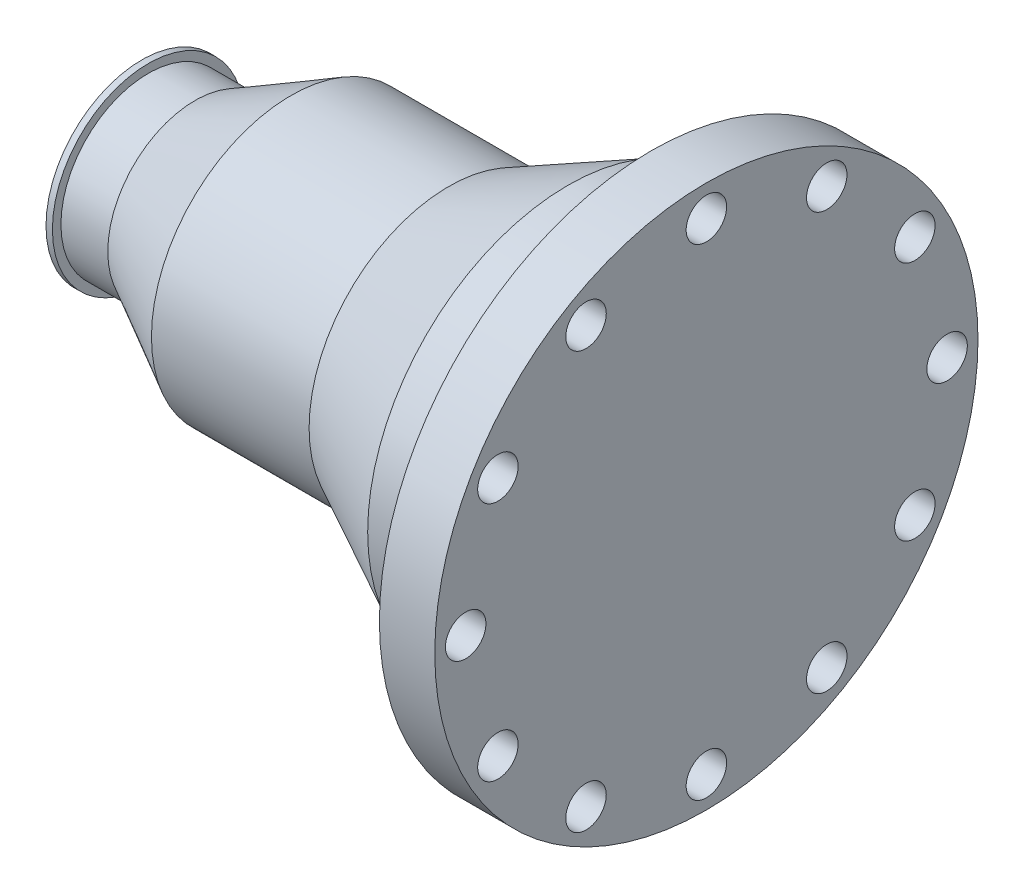
ISO-10303-21;
HEADER;
FILE_DESCRIPTION(('STEP AP214'),'2;1');
FILE_NAME('part.step','',(''),(''),'','','');
FILE_SCHEMA(('AUTOMOTIVE_DESIGN { 1 0 10303 214 1 1 1 1 }'));
ENDSEC;
DATA;
#1=APPLICATION_CONTEXT('core data for automotive mechanical design processes');
#2=APPLICATION_PROTOCOL_DEFINITION('international standard','automotive_design',2000,#1);
#3=PRODUCT_CONTEXT('',#1,'mechanical');
#4=PRODUCT('Part','Part','',(#3));
#5=PRODUCT_RELATED_PRODUCT_CATEGORY('part','',(#4));
#6=PRODUCT_DEFINITION_FORMATION('','',#4);
#7=PRODUCT_DEFINITION_CONTEXT('part definition',#1,'design');
#8=PRODUCT_DEFINITION('design','',#6,#7);
#9=PRODUCT_DEFINITION_SHAPE('','',#8);
#10=(LENGTH_UNIT() NAMED_UNIT(*) SI_UNIT(.MILLI.,.METRE.));
#11=(NAMED_UNIT(*) PLANE_ANGLE_UNIT() SI_UNIT($,.RADIAN.));
#12=(NAMED_UNIT(*) SI_UNIT($,.STERADIAN.) SOLID_ANGLE_UNIT());
#13=UNCERTAINTY_MEASURE_WITH_UNIT(LENGTH_MEASURE(1.E-05),#10,'distance_accuracy_value','');
#14=(GEOMETRIC_REPRESENTATION_CONTEXT(3) GLOBAL_UNCERTAINTY_ASSIGNED_CONTEXT((#13)) GLOBAL_UNIT_ASSIGNED_CONTEXT((#10,
#11,#12)) REPRESENTATION_CONTEXT('',''));
#15=CARTESIAN_POINT('',(0.,0.,0.));
#16=DIRECTION('',(0.,0.,1.));
#17=DIRECTION('',(1.,0.,0.));
#18=AXIS2_PLACEMENT_3D('',#15,#16,#17);
#19=CARTESIAN_POINT('',(0.,0.,0.));
#20=DIRECTION('',(1.,0.,0.));
#21=DIRECTION('',(0.,0.,-1.));
#22=AXIS2_PLACEMENT_3D('',#19,#20,#21);
#23=PLANE('',#22);
#24=CARTESIAN_POINT('',(0.,0.,0.));
#25=DIRECTION('',(-1.,0.,0.));
#26=DIRECTION('',(0.,0.,1.));
#27=AXIS2_PLACEMENT_3D('',#24,#25,#26);
#28=CIRCLE('',#27,31.);
#29=CARTESIAN_POINT('',(0.,0.,31.));
#30=VERTEX_POINT('',#29);
#31=EDGE_CURVE('E80',#30,#30,#28,.T.);
#32=ORIENTED_EDGE('',*,*,#31,.F.);
#33=EDGE_LOOP('',(#32));
#34=FACE_BOUND('',#33,.T.);
#35=CARTESIAN_POINT('',(0.,0.,0.));
#36=DIRECTION('',(-1.,0.,0.));
#37=DIRECTION('',(0.,0.,1.));
#38=AXIS2_PLACEMENT_3D('',#35,#36,#37);
#39=CIRCLE('',#38,45.);
#40=CARTESIAN_POINT('',(0.,0.,45.));
#41=VERTEX_POINT('',#40);
#42=EDGE_CURVE('E10',#41,#41,#39,.T.);
#43=ORIENTED_EDGE('',*,*,#42,.T.);
#44=EDGE_LOOP('',(#43));
#45=FACE_BOUND('',#44,.T.);
#46=ADVANCED_FACE('F37',(#34,#45),#23,.F.);
#47=CARTESIAN_POINT('',(0.,0.,0.));
#48=DIRECTION('',(-1.,0.,0.));
#49=DIRECTION('',(0.,0.,1.));
#50=AXIS2_PLACEMENT_3D('',#47,#48,#49);
#51=CYLINDRICAL_SURFACE('',#50,45.);
#52=ORIENTED_EDGE('',*,*,#42,.F.);
#53=EDGE_LOOP('',(#52));
#54=FACE_BOUND('',#53,.T.);
#55=CARTESIAN_POINT('',(3.,0.,0.));
#56=DIRECTION('',(-1.,0.,0.));
#57=DIRECTION('',(0.,0.,1.));
#58=AXIS2_PLACEMENT_3D('',#55,#56,#57);
#59=CIRCLE('',#58,45.);
#60=CARTESIAN_POINT('',(3.,0.,45.));
#61=VERTEX_POINT('',#60);
#62=EDGE_CURVE('E43',#61,#61,#59,.T.);
#63=ORIENTED_EDGE('',*,*,#62,.T.);
#64=EDGE_LOOP('',(#63));
#65=FACE_BOUND('',#64,.T.);
#66=ADVANCED_FACE('F238',(#54,#65),#51,.T.);
#67=CARTESIAN_POINT('',(3.,45.,0.));
#68=DIRECTION('',(-1.,0.,0.));
#69=DIRECTION('',(0.,0.,1.));
#70=AXIS2_PLACEMENT_3D('',#67,#68,#69);
#71=PLANE('',#70);
#72=ORIENTED_EDGE('',*,*,#62,.F.);
#73=EDGE_LOOP('',(#72));
#74=FACE_BOUND('',#73,.T.);
#75=CARTESIAN_POINT('',(3.,0.,0.));
#76=DIRECTION('',(-1.,0.,0.));
#77=DIRECTION('',(0.,0.,1.));
#78=AXIS2_PLACEMENT_3D('',#75,#76,#77);
#79=CIRCLE('',#78,41.);
#80=CARTESIAN_POINT('',(3.,0.,41.));
#81=VERTEX_POINT('',#80);
#82=EDGE_CURVE('E47',#81,#81,#79,.T.);
#83=ORIENTED_EDGE('',*,*,#82,.T.);
#84=EDGE_LOOP('',(#83));
#85=FACE_BOUND('',#84,.T.);
#86=ADVANCED_FACE('F244',(#74,#85),#71,.F.);
#87=CARTESIAN_POINT('',(0.,0.,0.));
#88=DIRECTION('',(-1.,0.,0.));
#89=DIRECTION('',(0.,0.,1.));
#90=AXIS2_PLACEMENT_3D('',#87,#88,#89);
#91=CYLINDRICAL_SURFACE('',#90,41.);
#92=ORIENTED_EDGE('',*,*,#82,.F.);
#93=EDGE_LOOP('',(#92));
#94=FACE_BOUND('',#93,.T.);
#95=CARTESIAN_POINT('',(25.,0.,0.));
#96=DIRECTION('',(-1.,0.,0.));
#97=DIRECTION('',(0.,0.,1.));
#98=AXIS2_PLACEMENT_3D('',#95,#96,#97);
#99=CIRCLE('',#98,41.);
#100=CARTESIAN_POINT('',(25.,0.,41.));
#101=VERTEX_POINT('',#100);
#102=EDGE_CURVE('E51',#101,#101,#99,.T.);
#103=ORIENTED_EDGE('',*,*,#102,.T.);
#104=EDGE_LOOP('',(#103));
#105=FACE_BOUND('',#104,.T.);
#106=ADVANCED_FACE('F574',(#94,#105),#91,.T.);
#107=CARTESIAN_POINT('',(70.,0.,0.));
#108=DIRECTION('',(1.,0.,0.));
#109=DIRECTION('',(0.,0.,-1.));
#110=AXIS2_PLACEMENT_3D('',#107,#108,#109);
#111=CONICAL_SURFACE('',#110,65.5,0.498567905638218);
#112=ORIENTED_EDGE('',*,*,#102,.F.);
#113=EDGE_LOOP('',(#112));
#114=FACE_BOUND('',#113,.T.);
#115=CARTESIAN_POINT('',(70.,0.,0.));
#116=DIRECTION('',(-1.,0.,0.));
#117=DIRECTION('',(0.,0.,1.));
#118=AXIS2_PLACEMENT_3D('',#115,#116,#117);
#119=CIRCLE('',#118,65.5);
#120=CARTESIAN_POINT('',(70.,0.,65.5));
#121=VERTEX_POINT('',#120);
#122=EDGE_CURVE('E56',#121,#121,#119,.T.);
#123=ORIENTED_EDGE('',*,*,#122,.T.);
#124=EDGE_LOOP('',(#123));
#125=FACE_BOUND('',#124,.T.);
#126=ADVANCED_FACE('F565',(#114,#125),#111,.T.);
#127=CARTESIAN_POINT('',(0.,0.,0.));
#128=DIRECTION('',(-1.,0.,0.));
#129=DIRECTION('',(0.,0.,1.));
#130=AXIS2_PLACEMENT_3D('',#127,#128,#129);
#131=CYLINDRICAL_SURFACE('',#130,65.5);
#132=ORIENTED_EDGE('',*,*,#122,.F.);
#133=EDGE_LOOP('',(#132));
#134=FACE_BOUND('',#133,.T.);
#135=CARTESIAN_POINT('',(144.,0.,0.));
#136=DIRECTION('',(-1.,0.,0.));
#137=DIRECTION('',(0.,0.,1.));
#138=AXIS2_PLACEMENT_3D('',#135,#136,#137);
#139=CIRCLE('',#138,65.5);
#140=CARTESIAN_POINT('',(144.,0.,65.5));
#141=VERTEX_POINT('',#140);
#142=EDGE_CURVE('E59',#141,#141,#139,.T.);
#143=ORIENTED_EDGE('',*,*,#142,.T.);
#144=EDGE_LOOP('',(#143));
#145=FACE_BOUND('',#144,.T.);
#146=ADVANCED_FACE('F556',(#134,#145),#131,.T.);
#147=CARTESIAN_POINT('',(200.,0.,0.));
#148=DIRECTION('',(1.,0.,0.));
#149=DIRECTION('',(0.,0.,-1.));
#150=AXIS2_PLACEMENT_3D('',#147,#148,#149);
#151=CONICAL_SURFACE('',#150,94.,0.470764926542016);
#152=ORIENTED_EDGE('',*,*,#142,.F.);
#153=EDGE_LOOP('',(#152));
#154=FACE_BOUND('',#153,.T.);
#155=CARTESIAN_POINT('',(200.,0.,0.));
#156=DIRECTION('',(-1.,0.,0.));
#157=DIRECTION('',(0.,0.,1.));
#158=AXIS2_PLACEMENT_3D('',#155,#156,#157);
#159=CIRCLE('',#158,94.);
#160=CARTESIAN_POINT('',(200.,0.,94.));
#161=VERTEX_POINT('',#160);
#162=EDGE_CURVE('E62',#161,#161,#159,.T.);
#163=ORIENTED_EDGE('',*,*,#162,.T.);
#164=EDGE_LOOP('',(#163));
#165=FACE_BOUND('',#164,.T.);
#166=ADVANCED_FACE('F547',(#154,#165),#151,.T.);
#167=CARTESIAN_POINT('',(0.,0.,0.));
#168=DIRECTION('',(-1.,0.,0.));
#169=DIRECTION('',(0.,0.,1.));
#170=AXIS2_PLACEMENT_3D('',#167,#168,#169);
#171=CYLINDRICAL_SURFACE('',#170,94.);
#172=ORIENTED_EDGE('',*,*,#162,.F.);
#173=EDGE_LOOP('',(#172));
#174=FACE_BOUND('',#173,.T.);
#175=CARTESIAN_POINT('',(220.,0.,0.));
#176=DIRECTION('',(-1.,0.,0.));
#177=DIRECTION('',(0.,0.,1.));
#178=AXIS2_PLACEMENT_3D('',#175,#176,#177);
#179=CIRCLE('',#178,94.);
#180=CARTESIAN_POINT('',(220.,0.,94.));
#181=VERTEX_POINT('',#180);
#182=EDGE_CURVE('E65',#181,#181,#179,.T.);
#183=ORIENTED_EDGE('',*,*,#182,.T.);
#184=EDGE_LOOP('',(#183));
#185=FACE_BOUND('',#184,.T.);
#186=ADVANCED_FACE('F538',(#174,#185),#171,.T.);
#187=CARTESIAN_POINT('',(220.,94.,0.));
#188=DIRECTION('',(1.,0.,0.));
#189=DIRECTION('',(0.,0.,-1.));
#190=AXIS2_PLACEMENT_3D('',#187,#188,#189);
#191=PLANE('',#190);
#192=ORIENTED_EDGE('',*,*,#182,.F.);
#193=EDGE_LOOP('',(#192));
#194=FACE_BOUND('',#193,.T.);
#195=CARTESIAN_POINT('',(220.,0.,0.));
#196=DIRECTION('',(-1.,0.,0.));
#197=DIRECTION('',(0.,0.,1.));
#198=AXIS2_PLACEMENT_3D('',#195,#196,#197);
#199=CIRCLE('',#198,95.);
#200=CARTESIAN_POINT('',(220.,0.,95.));
#201=VERTEX_POINT('',#200);
#202=EDGE_CURVE('E68',#201,#201,#199,.T.);
#203=ORIENTED_EDGE('',*,*,#202,.T.);
#204=EDGE_LOOP('',(#203));
#205=FACE_BOUND('',#204,.T.);
#206=ADVANCED_FACE('F529',(#194,#205),#191,.F.);
#207=CARTESIAN_POINT('',(0.,0.,0.));
#208=DIRECTION('',(-1.,0.,0.));
#209=DIRECTION('',(0.,0.,1.));
#210=AXIS2_PLACEMENT_3D('',#207,#208,#209);
#211=CYLINDRICAL_SURFACE('',#210,95.);
#212=ORIENTED_EDGE('',*,*,#202,.F.);
#213=EDGE_LOOP('',(#212));
#214=FACE_BOUND('',#213,.T.);
#215=CARTESIAN_POINT('',(239.,0.,0.));
#216=DIRECTION('',(-1.,0.,0.));
#217=DIRECTION('',(0.,0.,1.));
#218=AXIS2_PLACEMENT_3D('',#215,#216,#217);
#219=CIRCLE('',#218,95.);
#220=CARTESIAN_POINT('',(239.,0.,95.));
#221=VERTEX_POINT('',#220);
#222=EDGE_CURVE('E71',#221,#221,#219,.T.);
#223=ORIENTED_EDGE('',*,*,#222,.T.);
#224=EDGE_LOOP('',(#223));
#225=FACE_BOUND('',#224,.T.);
#226=ADVANCED_FACE('F234',(#214,#225),#211,.T.);
#227=CARTESIAN_POINT('',(239.,100.,0.));
#228=DIRECTION('',(1.,0.,0.));
#229=DIRECTION('',(0.,0.,-1.));
#230=AXIS2_PLACEMENT_3D('',#227,#228,#229);
#231=PLANE('',#230);
#232=CARTESIAN_POINT('',(239.,97.8608706276416,-56.5));
#233=DIRECTION('',(1.,0.,0.));
#234=DIRECTION('',(0.,0.,-1.));
#235=AXIS2_PLACEMENT_3D('',#232,#233,#234);
#236=CIRCLE('',#235,9.50000000000001);
#237=CARTESIAN_POINT('',(239.,97.8608706276416,-66.));
#238=VERTEX_POINT('',#237);
#239=EDGE_CURVE('E185',#238,#238,#236,.F.);
#240=ORIENTED_EDGE('',*,*,#239,.F.);
#241=EDGE_LOOP('',(#240));
#242=FACE_BOUND('',#241,.T.);
#243=CARTESIAN_POINT('',(239.,56.4999999999999,-97.8608706276416));
#244=DIRECTION('',(1.,0.,0.));
#245=DIRECTION('',(0.,0.,-1.));
#246=AXIS2_PLACEMENT_3D('',#243,#244,#245);
#247=CIRCLE('',#246,9.5);
#248=CARTESIAN_POINT('',(239.,56.4999999999999,-107.360870627642));
#249=VERTEX_POINT('',#248);
#250=EDGE_CURVE('E179',#249,#249,#247,.F.);
#251=ORIENTED_EDGE('',*,*,#250,.F.);
#252=EDGE_LOOP('',(#251));
#253=FACE_BOUND('',#252,.T.);
#254=CARTESIAN_POINT('',(239.,0.,-113.));
#255=DIRECTION('',(1.,0.,0.));
#256=DIRECTION('',(0.,0.,-1.));
#257=AXIS2_PLACEMENT_3D('',#254,#255,#256);
#258=CIRCLE('',#257,9.49999999999999);
#259=CARTESIAN_POINT('',(239.,0.,-122.5));
#260=VERTEX_POINT('',#259);
#261=EDGE_CURVE('E173',#260,#260,#258,.F.);
#262=ORIENTED_EDGE('',*,*,#261,.F.);
#263=EDGE_LOOP('',(#262));
#264=FACE_BOUND('',#263,.T.);
#265=CARTESIAN_POINT('',(239.,-56.5,-97.8608706276415));
#266=DIRECTION('',(1.,0.,0.));
#267=DIRECTION('',(0.,0.,-1.));
#268=AXIS2_PLACEMENT_3D('',#265,#266,#267);
#269=CIRCLE('',#268,9.5);
#270=CARTESIAN_POINT('',(239.,-56.5,-107.360870627642));
#271=VERTEX_POINT('',#270);
#272=EDGE_CURVE('E167',#271,#271,#269,.F.);
#273=ORIENTED_EDGE('',*,*,#272,.F.);
#274=EDGE_LOOP('',(#273));
#275=FACE_BOUND('',#274,.T.);
#276=CARTESIAN_POINT('',(239.,-97.8608706276416,-56.5));
#277=DIRECTION('',(1.,0.,0.));
#278=DIRECTION('',(0.,0.,-1.));
#279=AXIS2_PLACEMENT_3D('',#276,#277,#278);
#280=CIRCLE('',#279,9.50000000000001);
#281=CARTESIAN_POINT('',(239.,-97.8608706276416,-66.));
#282=VERTEX_POINT('',#281);
#283=EDGE_CURVE('E161',#282,#282,#280,.F.);
#284=ORIENTED_EDGE('',*,*,#283,.F.);
#285=EDGE_LOOP('',(#284));
#286=FACE_BOUND('',#285,.T.);
#287=CARTESIAN_POINT('',(239.,-113.,0.));
#288=DIRECTION('',(1.,0.,0.));
#289=DIRECTION('',(0.,0.,-1.));
#290=AXIS2_PLACEMENT_3D('',#287,#288,#289);
#291=CIRCLE('',#290,9.49999999999998);
#292=CARTESIAN_POINT('',(239.,-113.,-9.49999999999998));
#293=VERTEX_POINT('',#292);
#294=EDGE_CURVE('E155',#293,#293,#291,.F.);
#295=ORIENTED_EDGE('',*,*,#294,.F.);
#296=EDGE_LOOP('',(#295));
#297=FACE_BOUND('',#296,.T.);
#298=CARTESIAN_POINT('',(239.,-97.8608706276415,56.5));
#299=DIRECTION('',(1.,0.,0.));
#300=DIRECTION('',(0.,0.,-1.));
#301=AXIS2_PLACEMENT_3D('',#298,#299,#300);
#302=CIRCLE('',#301,9.5);
#303=CARTESIAN_POINT('',(239.,-97.8608706276415,47.));
#304=VERTEX_POINT('',#303);
#305=EDGE_CURVE('E149',#304,#304,#302,.F.);
#306=ORIENTED_EDGE('',*,*,#305,.F.);
#307=EDGE_LOOP('',(#306));
#308=FACE_BOUND('',#307,.T.);
#309=CARTESIAN_POINT('',(239.,-56.5,97.8608706276416));
#310=DIRECTION('',(1.,0.,0.));
#311=DIRECTION('',(0.,0.,-1.));
#312=AXIS2_PLACEMENT_3D('',#309,#310,#311);
#313=CIRCLE('',#312,9.5);
#314=CARTESIAN_POINT('',(239.,-56.5,88.3608706276416));
#315=VERTEX_POINT('',#314);
#316=EDGE_CURVE('E143',#315,#315,#313,.F.);
#317=ORIENTED_EDGE('',*,*,#316,.F.);
#318=EDGE_LOOP('',(#317));
#319=FACE_BOUND('',#318,.T.);
#320=CARTESIAN_POINT('',(239.,0.,113.));
#321=DIRECTION('',(1.,0.,0.));
#322=DIRECTION('',(0.,0.,-1.));
#323=AXIS2_PLACEMENT_3D('',#320,#321,#322);
#324=CIRCLE('',#323,9.49999999999999);
#325=CARTESIAN_POINT('',(239.,0.,103.5));
#326=VERTEX_POINT('',#325);
#327=EDGE_CURVE('E137',#326,#326,#324,.F.);
#328=ORIENTED_EDGE('',*,*,#327,.F.);
#329=EDGE_LOOP('',(#328));
#330=FACE_BOUND('',#329,.T.);
#331=CARTESIAN_POINT('',(239.,56.5,97.8608706276416));
#332=DIRECTION('',(1.,0.,0.));
#333=DIRECTION('',(0.,0.,-1.));
#334=AXIS2_PLACEMENT_3D('',#331,#332,#333);
#335=CIRCLE('',#334,9.5);
#336=CARTESIAN_POINT('',(239.,56.5,88.3608706276416));
#337=VERTEX_POINT('',#336);
#338=EDGE_CURVE('E131',#337,#337,#335,.F.);
#339=ORIENTED_EDGE('',*,*,#338,.F.);
#340=EDGE_LOOP('',(#339));
#341=FACE_BOUND('',#340,.T.);
#342=CARTESIAN_POINT('',(239.,97.8608706276416,56.5));
#343=DIRECTION('',(1.,0.,0.));
#344=DIRECTION('',(0.,0.,-1.));
#345=AXIS2_PLACEMENT_3D('',#342,#343,#344);
#346=CIRCLE('',#345,9.5);
#347=CARTESIAN_POINT('',(239.,97.8608706276416,47.));
#348=VERTEX_POINT('',#347);
#349=EDGE_CURVE('E125',#348,#348,#346,.F.);
#350=ORIENTED_EDGE('',*,*,#349,.F.);
#351=EDGE_LOOP('',(#350));
#352=FACE_BOUND('',#351,.T.);
#353=CARTESIAN_POINT('',(239.,113.,0.));
#354=DIRECTION('',(1.,0.,0.));
#355=DIRECTION('',(0.,0.,-1.));
#356=AXIS2_PLACEMENT_3D('',#353,#354,#355);
#357=CIRCLE('',#356,9.50000000000001);
#358=CARTESIAN_POINT('',(239.,113.,-9.50000000000001));
#359=VERTEX_POINT('',#358);
#360=EDGE_CURVE('E119',#359,#359,#357,.F.);
#361=ORIENTED_EDGE('',*,*,#360,.F.);
#362=EDGE_LOOP('',(#361));
#363=FACE_BOUND('',#362,.T.);
#364=ORIENTED_EDGE('',*,*,#222,.F.);
#365=EDGE_LOOP('',(#364));
#366=FACE_BOUND('',#365,.T.);
#367=CARTESIAN_POINT('',(239.,0.,0.));
#368=DIRECTION('',(-1.,0.,0.));
#369=DIRECTION('',(0.,0.,1.));
#370=AXIS2_PLACEMENT_3D('',#367,#368,#369);
#371=CIRCLE('',#370,127.5);
#372=CARTESIAN_POINT('',(239.,0.,127.5));
#373=VERTEX_POINT('',#372);
#374=EDGE_CURVE('E74',#373,#373,#371,.T.);
#375=ORIENTED_EDGE('',*,*,#374,.T.);
#376=EDGE_LOOP('',(#375));
#377=FACE_BOUND('',#376,.T.);
#378=ADVANCED_FACE('F226',(#242,#253,#264,#275,#286,#297,#308,#319,#330,#341,#352,#363,#366,
#377),#231,.F.);
#379=CARTESIAN_POINT('',(0.,0.,0.));
#380=DIRECTION('',(-1.,0.,0.));
#381=DIRECTION('',(0.,0.,1.));
#382=AXIS2_PLACEMENT_3D('',#379,#380,#381);
#383=CYLINDRICAL_SURFACE('',#382,127.5);
#384=ORIENTED_EDGE('',*,*,#374,.F.);
#385=EDGE_LOOP('',(#384));
#386=FACE_BOUND('',#385,.T.);
#387=CARTESIAN_POINT('',(265.,0.,0.));
#388=DIRECTION('',(-1.,0.,0.));
#389=DIRECTION('',(0.,0.,1.));
#390=AXIS2_PLACEMENT_3D('',#387,#388,#389);
#391=CIRCLE('',#390,127.5);
#392=CARTESIAN_POINT('',(265.,0.,127.5));
#393=VERTEX_POINT('',#392);
#394=EDGE_CURVE('E77',#393,#393,#391,.T.);
#395=ORIENTED_EDGE('',*,*,#394,.T.);
#396=EDGE_LOOP('',(#395));
#397=FACE_BOUND('',#396,.T.);
#398=ADVANCED_FACE('F199',(#386,#397),#383,.T.);
#399=CARTESIAN_POINT('',(265.,127.5,0.));
#400=DIRECTION('',(-1.,0.,0.));
#401=DIRECTION('',(0.,0.,1.));
#402=AXIS2_PLACEMENT_3D('',#399,#400,#401);
#403=PLANE('',#402);
#404=CARTESIAN_POINT('',(265.,97.8608706276416,-56.5));
#405=DIRECTION('',(1.,0.,0.));
#406=DIRECTION('',(0.,0.,-1.));
#407=AXIS2_PLACEMENT_3D('',#404,#405,#406);
#408=CIRCLE('',#407,9.50000000000001);
#409=CARTESIAN_POINT('',(265.,97.8608706276416,-66.));
#410=VERTEX_POINT('',#409);
#411=EDGE_CURVE('E188',#410,#410,#408,.T.);
#412=ORIENTED_EDGE('',*,*,#411,.F.);
#413=EDGE_LOOP('',(#412));
#414=FACE_BOUND('',#413,.T.);
#415=CARTESIAN_POINT('',(265.,56.4999999999999,-97.8608706276416));
#416=DIRECTION('',(1.,0.,0.));
#417=DIRECTION('',(0.,0.,-1.));
#418=AXIS2_PLACEMENT_3D('',#415,#416,#417);
#419=CIRCLE('',#418,9.5);
#420=CARTESIAN_POINT('',(265.,56.4999999999999,-107.360870627642));
#421=VERTEX_POINT('',#420);
#422=EDGE_CURVE('E182',#421,#421,#419,.T.);
#423=ORIENTED_EDGE('',*,*,#422,.F.);
#424=EDGE_LOOP('',(#423));
#425=FACE_BOUND('',#424,.T.);
#426=CARTESIAN_POINT('',(265.,0.,-113.));
#427=DIRECTION('',(1.,0.,0.));
#428=DIRECTION('',(0.,0.,-1.));
#429=AXIS2_PLACEMENT_3D('',#426,#427,#428);
#430=CIRCLE('',#429,9.49999999999999);
#431=CARTESIAN_POINT('',(265.,0.,-122.5));
#432=VERTEX_POINT('',#431);
#433=EDGE_CURVE('E176',#432,#432,#430,.T.);
#434=ORIENTED_EDGE('',*,*,#433,.F.);
#435=EDGE_LOOP('',(#434));
#436=FACE_BOUND('',#435,.T.);
#437=CARTESIAN_POINT('',(265.,-56.5,-97.8608706276415));
#438=DIRECTION('',(1.,0.,0.));
#439=DIRECTION('',(0.,0.,-1.));
#440=AXIS2_PLACEMENT_3D('',#437,#438,#439);
#441=CIRCLE('',#440,9.5);
#442=CARTESIAN_POINT('',(265.,-56.5,-107.360870627642));
#443=VERTEX_POINT('',#442);
#444=EDGE_CURVE('E170',#443,#443,#441,.T.);
#445=ORIENTED_EDGE('',*,*,#444,.F.);
#446=EDGE_LOOP('',(#445));
#447=FACE_BOUND('',#446,.T.);
#448=CARTESIAN_POINT('',(265.,-97.8608706276416,-56.5));
#449=DIRECTION('',(1.,0.,0.));
#450=DIRECTION('',(0.,0.,-1.));
#451=AXIS2_PLACEMENT_3D('',#448,#449,#450);
#452=CIRCLE('',#451,9.50000000000001);
#453=CARTESIAN_POINT('',(265.,-97.8608706276416,-66.));
#454=VERTEX_POINT('',#453);
#455=EDGE_CURVE('E164',#454,#454,#452,.T.);
#456=ORIENTED_EDGE('',*,*,#455,.F.);
#457=EDGE_LOOP('',(#456));
#458=FACE_BOUND('',#457,.T.);
#459=CARTESIAN_POINT('',(265.,-113.,0.));
#460=DIRECTION('',(1.,0.,0.));
#461=DIRECTION('',(0.,0.,-1.));
#462=AXIS2_PLACEMENT_3D('',#459,#460,#461);
#463=CIRCLE('',#462,9.49999999999998);
#464=CARTESIAN_POINT('',(265.,-113.,-9.49999999999998));
#465=VERTEX_POINT('',#464);
#466=EDGE_CURVE('E158',#465,#465,#463,.T.);
#467=ORIENTED_EDGE('',*,*,#466,.F.);
#468=EDGE_LOOP('',(#467));
#469=FACE_BOUND('',#468,.T.);
#470=CARTESIAN_POINT('',(265.,-97.8608706276415,56.5));
#471=DIRECTION('',(1.,0.,0.));
#472=DIRECTION('',(0.,0.,-1.));
#473=AXIS2_PLACEMENT_3D('',#470,#471,#472);
#474=CIRCLE('',#473,9.5);
#475=CARTESIAN_POINT('',(265.,-97.8608706276415,47.));
#476=VERTEX_POINT('',#475);
#477=EDGE_CURVE('E152',#476,#476,#474,.T.);
#478=ORIENTED_EDGE('',*,*,#477,.F.);
#479=EDGE_LOOP('',(#478));
#480=FACE_BOUND('',#479,.T.);
#481=CARTESIAN_POINT('',(265.,-56.5,97.8608706276416));
#482=DIRECTION('',(1.,0.,0.));
#483=DIRECTION('',(0.,0.,-1.));
#484=AXIS2_PLACEMENT_3D('',#481,#482,#483);
#485=CIRCLE('',#484,9.5);
#486=CARTESIAN_POINT('',(265.,-56.5,88.3608706276416));
#487=VERTEX_POINT('',#486);
#488=EDGE_CURVE('E146',#487,#487,#485,.T.);
#489=ORIENTED_EDGE('',*,*,#488,.F.);
#490=EDGE_LOOP('',(#489));
#491=FACE_BOUND('',#490,.T.);
#492=CARTESIAN_POINT('',(265.,0.,113.));
#493=DIRECTION('',(1.,0.,0.));
#494=DIRECTION('',(0.,0.,-1.));
#495=AXIS2_PLACEMENT_3D('',#492,#493,#494);
#496=CIRCLE('',#495,9.49999999999999);
#497=CARTESIAN_POINT('',(265.,0.,103.5));
#498=VERTEX_POINT('',#497);
#499=EDGE_CURVE('E140',#498,#498,#496,.T.);
#500=ORIENTED_EDGE('',*,*,#499,.F.);
#501=EDGE_LOOP('',(#500));
#502=FACE_BOUND('',#501,.T.);
#503=CARTESIAN_POINT('',(265.,56.5,97.8608706276416));
#504=DIRECTION('',(1.,0.,0.));
#505=DIRECTION('',(0.,0.,-1.));
#506=AXIS2_PLACEMENT_3D('',#503,#504,#505);
#507=CIRCLE('',#506,9.5);
#508=CARTESIAN_POINT('',(265.,56.5,88.3608706276416));
#509=VERTEX_POINT('',#508);
#510=EDGE_CURVE('E134',#509,#509,#507,.T.);
#511=ORIENTED_EDGE('',*,*,#510,.F.);
#512=EDGE_LOOP('',(#511));
#513=FACE_BOUND('',#512,.T.);
#514=CARTESIAN_POINT('',(265.,97.8608706276416,56.5));
#515=DIRECTION('',(1.,0.,0.));
#516=DIRECTION('',(0.,0.,-1.));
#517=AXIS2_PLACEMENT_3D('',#514,#515,#516);
#518=CIRCLE('',#517,9.5);
#519=CARTESIAN_POINT('',(265.,97.8608706276416,47.));
#520=VERTEX_POINT('',#519);
#521=EDGE_CURVE('E128',#520,#520,#518,.T.);
#522=ORIENTED_EDGE('',*,*,#521,.F.);
#523=EDGE_LOOP('',(#522));
#524=FACE_BOUND('',#523,.T.);
#525=CARTESIAN_POINT('',(265.,113.,0.));
#526=DIRECTION('',(1.,0.,0.));
#527=DIRECTION('',(0.,0.,-1.));
#528=AXIS2_PLACEMENT_3D('',#525,#526,#527);
#529=CIRCLE('',#528,9.50000000000001);
#530=CARTESIAN_POINT('',(265.,113.,-9.50000000000001));
#531=VERTEX_POINT('',#530);
#532=EDGE_CURVE('E122',#531,#531,#529,.T.);
#533=ORIENTED_EDGE('',*,*,#532,.F.);
#534=EDGE_LOOP('',(#533));
#535=FACE_BOUND('',#534,.T.);
#536=ORIENTED_EDGE('',*,*,#394,.F.);
#537=EDGE_LOOP('',(#536));
#538=FACE_BOUND('',#537,.T.);
#539=ADVANCED_FACE('F195',(#414,#425,#436,#447,#458,#469,#480,#491,#502,#513,#524,#535,#538),
#403,.F.);
#540=CARTESIAN_POINT('',(0.,0.,0.));
#541=DIRECTION('',(-1.,0.,0.));
#542=DIRECTION('',(0.,0.,1.));
#543=AXIS2_PLACEMENT_3D('',#540,#541,#542);
#544=CYLINDRICAL_SURFACE('',#543,31.);
#545=ORIENTED_EDGE('',*,*,#31,.T.);
#546=EDGE_LOOP('',(#545));
#547=FACE_BOUND('',#546,.T.);
#548=CARTESIAN_POINT('',(42.,0.,0.));
#549=DIRECTION('',(-1.,0.,0.));
#550=DIRECTION('',(0.,0.,1.));
#551=AXIS2_PLACEMENT_3D('',#548,#549,#550);
#552=CIRCLE('',#551,31.);
#553=CARTESIAN_POINT('',(42.,0.,31.));
#554=VERTEX_POINT('',#553);
#555=EDGE_CURVE('E83',#554,#554,#552,.T.);
#556=ORIENTED_EDGE('',*,*,#555,.F.);
#557=EDGE_LOOP('',(#556));
#558=FACE_BOUND('',#557,.T.);
#559=ADVANCED_FACE('F198',(#547,#558),#544,.F.);
#560=CARTESIAN_POINT('',(70.,0.,0.));
#561=DIRECTION('',(1.,0.,0.));
#562=DIRECTION('',(0.,0.,-1.));
#563=AXIS2_PLACEMENT_3D('',#560,#561,#562);
#564=CONICAL_SURFACE('',#563,38.502577,0.261799374867879);
#565=ORIENTED_EDGE('',*,*,#555,.T.);
#566=EDGE_LOOP('',(#565));
#567=FACE_BOUND('',#566,.T.);
#568=CARTESIAN_POINT('',(70.,0.,0.));
#569=DIRECTION('',(-1.,0.,0.));
#570=DIRECTION('',(0.,0.,1.));
#571=AXIS2_PLACEMENT_3D('',#568,#569,#570);
#572=CIRCLE('',#571,38.502577);
#573=CARTESIAN_POINT('',(70.,0.,38.502577));
#574=VERTEX_POINT('',#573);
#575=EDGE_CURVE('E86',#574,#574,#572,.T.);
#576=ORIENTED_EDGE('',*,*,#575,.F.);
#577=EDGE_LOOP('',(#576));
#578=FACE_BOUND('',#577,.T.);
#579=ADVANCED_FACE('F249',(#567,#578),#564,.F.);
#580=CARTESIAN_POINT('',(107.802202951022,0.,0.));
#581=DIRECTION('',(-1.,0.,0.));
#582=DIRECTION('',(0.,0.,1.));
#583=AXIS2_PLACEMENT_3D('',#580,#581,#582);
#584=DEGENERATE_TOROIDAL_SURFACE('',#583,5.77654352226822,49.9999981513586,.T.);
#585=ORIENTED_EDGE('',*,*,#575,.T.);
#586=EDGE_LOOP('',(#585));
#587=FACE_BOUND('',#586,.T.);
#588=CARTESIAN_POINT('',(90.,0.,0.));
#589=DIRECTION('',(-1.,0.,0.));
#590=DIRECTION('',(0.,0.,1.));
#591=AXIS2_PLACEMENT_3D('',#588,#589,#590);
#592=CIRCLE('',#591,52.5);
#593=CARTESIAN_POINT('',(90.,0.,52.5));
#594=VERTEX_POINT('',#593);
#595=EDGE_CURVE('E89',#594,#594,#592,.T.);
#596=ORIENTED_EDGE('',*,*,#595,.F.);
#597=EDGE_LOOP('',(#596));
#598=FACE_BOUND('',#597,.T.);
#599=ADVANCED_FACE('F255',(#587,#598),#584,.F.);
#600=CARTESIAN_POINT('',(0.,0.,0.));
#601=DIRECTION('',(-1.,0.,0.));
#602=DIRECTION('',(0.,0.,1.));
#603=AXIS2_PLACEMENT_3D('',#600,#601,#602);
#604=CYLINDRICAL_SURFACE('',#603,52.5);
#605=ORIENTED_EDGE('',*,*,#595,.T.);
#606=EDGE_LOOP('',(#605));
#607=FACE_BOUND('',#606,.T.);
#608=CARTESIAN_POINT('',(142.,0.,0.));
#609=DIRECTION('',(-1.,0.,0.));
#610=DIRECTION('',(0.,0.,1.));
#611=AXIS2_PLACEMENT_3D('',#608,#609,#610);
#612=CIRCLE('',#611,52.5);
#613=CARTESIAN_POINT('',(142.,0.,52.5));
#614=VERTEX_POINT('',#613);
#615=EDGE_CURVE('E92',#614,#614,#612,.T.);
#616=ORIENTED_EDGE('',*,*,#615,.F.);
#617=EDGE_LOOP('',(#616));
#618=FACE_BOUND('',#617,.T.);
#619=ADVANCED_FACE('F261',(#607,#618),#604,.F.);
#620=CARTESIAN_POINT('',(142.75,0.,0.));
#621=DIRECTION('',(-1.,0.,0.));
#622=DIRECTION('',(0.,0.,1.));
#623=AXIS2_PLACEMENT_3D('',#620,#621,#622);
#624=TOROIDAL_SURFACE('',#623,49.8031848031275,2.79916276877255);
#625=ORIENTED_EDGE('',*,*,#615,.T.);
#626=EDGE_LOOP('',(#625));
#627=FACE_BOUND('',#626,.T.);
#628=CARTESIAN_POINT('',(143.5,0.,0.));
#629=DIRECTION('',(-1.,0.,0.));
#630=DIRECTION('',(0.,0.,1.));
#631=AXIS2_PLACEMENT_3D('',#628,#629,#630);
#632=CIRCLE('',#631,52.5);
#633=CARTESIAN_POINT('',(143.5,0.,52.5));
#634=VERTEX_POINT('',#633);
#635=EDGE_CURVE('E95',#634,#634,#632,.T.);
#636=ORIENTED_EDGE('',*,*,#635,.F.);
#637=EDGE_LOOP('',(#636));
#638=FACE_BOUND('',#637,.T.);
#639=ADVANCED_FACE('F267',(#627,#638),#624,.F.);
#640=CARTESIAN_POINT('',(0.,0.,0.));
#641=DIRECTION('',(-1.,0.,0.));
#642=DIRECTION('',(0.,0.,1.));
#643=AXIS2_PLACEMENT_3D('',#640,#641,#642);
#644=CYLINDRICAL_SURFACE('',#643,52.5);
#645=ORIENTED_EDGE('',*,*,#635,.T.);
#646=EDGE_LOOP('',(#645));
#647=FACE_BOUND('',#646,.T.);
#648=CARTESIAN_POINT('',(146.669872,0.,0.));
#649=DIRECTION('',(-1.,0.,0.));
#650=DIRECTION('',(0.,0.,1.));
#651=AXIS2_PLACEMENT_3D('',#648,#649,#650);
#652=CIRCLE('',#651,52.5);
#653=CARTESIAN_POINT('',(146.669872,0.,52.5));
#654=VERTEX_POINT('',#653);
#655=EDGE_CURVE('E98',#654,#654,#652,.T.);
#656=ORIENTED_EDGE('',*,*,#655,.F.);
#657=EDGE_LOOP('',(#656));
#658=FACE_BOUND('',#657,.T.);
#659=ADVANCED_FACE('F273',(#647,#658),#644,.F.);
#660=CARTESIAN_POINT('',(147.593438045,0.,0.));
#661=DIRECTION('',(-1.,0.,0.));
#662=DIRECTION('',(0.,0.,1.));
#663=AXIS2_PLACEMENT_3D('',#660,#661,#662);
#664=TOROIDAL_SURFACE('',#663,53.580573582,1.42148285448445);
#665=ORIENTED_EDGE('',*,*,#655,.T.);
#666=EDGE_LOOP('',(#665));
#667=FACE_BOUND('',#666,.T.);
#668=CARTESIAN_POINT('',(147.669872,0.,0.));
#669=DIRECTION('',(-1.,0.,0.));
#670=DIRECTION('',(0.,0.,1.));
#671=AXIS2_PLACEMENT_3D('',#668,#669,#670);
#672=CIRCLE('',#671,55.);
#673=CARTESIAN_POINT('',(147.669872,0.,55.));
#674=VERTEX_POINT('',#673);
#675=EDGE_CURVE('E101',#674,#674,#672,.T.);
#676=ORIENTED_EDGE('',*,*,#675,.F.);
#677=EDGE_LOOP('',(#676));
#678=FACE_BOUND('',#677,.T.);
#679=ADVANCED_FACE('F279',(#667,#678),#664,.F.);
#680=CARTESIAN_POINT('',(0.,0.,0.));
#681=DIRECTION('',(-1.,0.,0.));
#682=DIRECTION('',(0.,0.,1.));
#683=AXIS2_PLACEMENT_3D('',#680,#681,#682);
#684=CYLINDRICAL_SURFACE('',#683,55.);
#685=ORIENTED_EDGE('',*,*,#675,.T.);
#686=EDGE_LOOP('',(#685));
#687=FACE_BOUND('',#686,.T.);
#688=CARTESIAN_POINT('',(203.5,0.,0.));
#689=DIRECTION('',(-1.,0.,0.));
#690=DIRECTION('',(0.,0.,1.));
#691=AXIS2_PLACEMENT_3D('',#688,#689,#690);
#692=CIRCLE('',#691,55.);
#693=CARTESIAN_POINT('',(203.5,0.,55.));
#694=VERTEX_POINT('',#693);
#695=EDGE_CURVE('E104',#694,#694,#692,.T.);
#696=ORIENTED_EDGE('',*,*,#695,.F.);
#697=EDGE_LOOP('',(#696));
#698=FACE_BOUND('',#697,.T.);
#699=ADVANCED_FACE('F285',(#687,#698),#684,.F.);
#700=CARTESIAN_POINT('',(203.5,55.,0.));
#701=DIRECTION('',(-1.,0.,0.));
#702=DIRECTION('',(0.,0.,1.));
#703=AXIS2_PLACEMENT_3D('',#700,#701,#702);
#704=PLANE('',#703);
#705=ORIENTED_EDGE('',*,*,#695,.T.);
#706=EDGE_LOOP('',(#705));
#707=FACE_BOUND('',#706,.T.);
#708=CARTESIAN_POINT('',(203.5,0.,0.));
#709=DIRECTION('',(-1.,0.,0.));
#710=DIRECTION('',(0.,0.,1.));
#711=AXIS2_PLACEMENT_3D('',#708,#709,#710);
#712=CIRCLE('',#711,47.);
#713=CARTESIAN_POINT('',(203.5,0.,47.));
#714=VERTEX_POINT('',#713);
#715=EDGE_CURVE('E107',#714,#714,#712,.T.);
#716=ORIENTED_EDGE('',*,*,#715,.F.);
#717=EDGE_LOOP('',(#716));
#718=FACE_BOUND('',#717,.T.);
#719=ADVANCED_FACE('F291',(#707,#718),#704,.T.);
#720=CARTESIAN_POINT('',(0.,0.,0.));
#721=DIRECTION('',(-1.,0.,0.));
#722=DIRECTION('',(0.,0.,1.));
#723=AXIS2_PLACEMENT_3D('',#720,#721,#722);
#724=CYLINDRICAL_SURFACE('',#723,47.);
#725=ORIENTED_EDGE('',*,*,#715,.T.);
#726=EDGE_LOOP('',(#725));
#727=FACE_BOUND('',#726,.T.);
#728=CARTESIAN_POINT('',(226.,0.,0.));
#729=DIRECTION('',(-1.,0.,0.));
#730=DIRECTION('',(0.,0.,1.));
#731=AXIS2_PLACEMENT_3D('',#728,#729,#730);
#732=CIRCLE('',#731,47.);
#733=CARTESIAN_POINT('',(226.,0.,47.));
#734=VERTEX_POINT('',#733);
#735=EDGE_CURVE('E110',#734,#734,#732,.T.);
#736=ORIENTED_EDGE('',*,*,#735,.F.);
#737=EDGE_LOOP('',(#736));
#738=FACE_BOUND('',#737,.T.);
#739=ADVANCED_FACE('F297',(#727,#738),#724,.F.);
#740=CARTESIAN_POINT('',(239.,0.,0.));
#741=DIRECTION('',(-1.,0.,0.));
#742=DIRECTION('',(0.,0.,1.));
#743=AXIS2_PLACEMENT_3D('',#740,#741,#742);
#744=CONICAL_SURFACE('',#743,34.,0.785398163397449);
#745=ORIENTED_EDGE('',*,*,#735,.T.);
#746=EDGE_LOOP('',(#745));
#747=FACE_BOUND('',#746,.T.);
#748=CARTESIAN_POINT('',(239.,0.,0.));
#749=DIRECTION('',(-1.,0.,0.));
#750=DIRECTION('',(0.,0.,1.));
#751=AXIS2_PLACEMENT_3D('',#748,#749,#750);
#752=CIRCLE('',#751,34.);
#753=CARTESIAN_POINT('',(239.,0.,34.));
#754=VERTEX_POINT('',#753);
#755=EDGE_CURVE('E113',#754,#754,#752,.T.);
#756=ORIENTED_EDGE('',*,*,#755,.F.);
#757=EDGE_LOOP('',(#756));
#758=FACE_BOUND('',#757,.T.);
#759=ADVANCED_FACE('F303',(#747,#758),#744,.F.);
#760=CARTESIAN_POINT('',(0.,0.,0.));
#761=DIRECTION('',(-1.,0.,0.));
#762=DIRECTION('',(0.,0.,1.));
#763=AXIS2_PLACEMENT_3D('',#760,#761,#762);
#764=CYLINDRICAL_SURFACE('',#763,34.);
#765=ORIENTED_EDGE('',*,*,#755,.T.);
#766=EDGE_LOOP('',(#765));
#767=FACE_BOUND('',#766,.T.);
#768=CARTESIAN_POINT('',(257.,0.,0.));
#769=DIRECTION('',(-1.,0.,0.));
#770=DIRECTION('',(0.,0.,1.));
#771=AXIS2_PLACEMENT_3D('',#768,#769,#770);
#772=CIRCLE('',#771,34.);
#773=CARTESIAN_POINT('',(257.,0.,34.));
#774=VERTEX_POINT('',#773);
#775=EDGE_CURVE('E116',#774,#774,#772,.T.);
#776=ORIENTED_EDGE('',*,*,#775,.F.);
#777=EDGE_LOOP('',(#776));
#778=FACE_BOUND('',#777,.T.);
#779=ADVANCED_FACE('F309',(#767,#778),#764,.F.);
#780=CARTESIAN_POINT('',(257.,34.,0.));
#781=DIRECTION('',(-1.,0.,0.));
#782=DIRECTION('',(0.,0.,1.));
#783=AXIS2_PLACEMENT_3D('',#780,#781,#782);
#784=PLANE('',#783);
#785=ORIENTED_EDGE('',*,*,#775,.T.);
#786=EDGE_LOOP('',(#785));
#787=FACE_BOUND('',#786,.T.);
#788=ADVANCED_FACE('F315',(#787),#784,.T.);
#789=CARTESIAN_POINT('',(265.,113.,0.));
#790=DIRECTION('',(-1.,0.,0.));
#791=DIRECTION('',(0.,0.,1.));
#792=AXIS2_PLACEMENT_3D('',#789,#790,#791);
#793=CYLINDRICAL_SURFACE('',#792,9.50000000000001);
#794=ORIENTED_EDGE('',*,*,#532,.T.);
#795=EDGE_LOOP('',(#794));
#796=FACE_BOUND('',#795,.T.);
#797=ORIENTED_EDGE('',*,*,#360,.T.);
#798=EDGE_LOOP('',(#797));
#799=FACE_BOUND('',#798,.T.);
#800=ADVANCED_FACE('F320',(#796,#799),#793,.F.);
#801=CARTESIAN_POINT('',(265.,97.8608706276416,56.5));
#802=DIRECTION('',(-1.,0.,0.));
#803=DIRECTION('',(0.,0.,1.));
#804=AXIS2_PLACEMENT_3D('',#801,#802,#803);
#805=CYLINDRICAL_SURFACE('',#804,9.5);
#806=ORIENTED_EDGE('',*,*,#521,.T.);
#807=EDGE_LOOP('',(#806));
#808=FACE_BOUND('',#807,.T.);
#809=ORIENTED_EDGE('',*,*,#349,.T.);
#810=EDGE_LOOP('',(#809));
#811=FACE_BOUND('',#810,.T.);
#812=ADVANCED_FACE('F325',(#808,#811),#805,.F.);
#813=CARTESIAN_POINT('',(265.,56.5,97.8608706276416));
#814=DIRECTION('',(-1.,0.,0.));
#815=DIRECTION('',(0.,0.,1.));
#816=AXIS2_PLACEMENT_3D('',#813,#814,#815);
#817=CYLINDRICAL_SURFACE('',#816,9.5);
#818=ORIENTED_EDGE('',*,*,#510,.T.);
#819=EDGE_LOOP('',(#818));
#820=FACE_BOUND('',#819,.T.);
#821=ORIENTED_EDGE('',*,*,#338,.T.);
#822=EDGE_LOOP('',(#821));
#823=FACE_BOUND('',#822,.T.);
#824=ADVANCED_FACE('F331',(#820,#823),#817,.F.);
#825=CARTESIAN_POINT('',(265.,0.,113.));
#826=DIRECTION('',(-1.,0.,0.));
#827=DIRECTION('',(0.,0.,1.));
#828=AXIS2_PLACEMENT_3D('',#825,#826,#827);
#829=CYLINDRICAL_SURFACE('',#828,9.49999999999999);
#830=ORIENTED_EDGE('',*,*,#499,.T.);
#831=EDGE_LOOP('',(#830));
#832=FACE_BOUND('',#831,.T.);
#833=ORIENTED_EDGE('',*,*,#327,.T.);
#834=EDGE_LOOP('',(#833));
#835=FACE_BOUND('',#834,.T.);
#836=ADVANCED_FACE('F335',(#832,#835),#829,.F.);
#837=CARTESIAN_POINT('',(265.,-56.5,97.8608706276416));
#838=DIRECTION('',(-1.,0.,0.));
#839=DIRECTION('',(0.,0.,1.));
#840=AXIS2_PLACEMENT_3D('',#837,#838,#839);
#841=CYLINDRICAL_SURFACE('',#840,9.5);
#842=ORIENTED_EDGE('',*,*,#488,.T.);
#843=EDGE_LOOP('',(#842));
#844=FACE_BOUND('',#843,.T.);
#845=ORIENTED_EDGE('',*,*,#316,.T.);
#846=EDGE_LOOP('',(#845));
#847=FACE_BOUND('',#846,.T.);
#848=ADVANCED_FACE('F339',(#844,#847),#841,.F.);
#849=CARTESIAN_POINT('',(265.,-97.8608706276415,56.5));
#850=DIRECTION('',(-1.,0.,0.));
#851=DIRECTION('',(0.,0.,1.));
#852=AXIS2_PLACEMENT_3D('',#849,#850,#851);
#853=CYLINDRICAL_SURFACE('',#852,9.5);
#854=ORIENTED_EDGE('',*,*,#477,.T.);
#855=EDGE_LOOP('',(#854));
#856=FACE_BOUND('',#855,.T.);
#857=ORIENTED_EDGE('',*,*,#305,.T.);
#858=EDGE_LOOP('',(#857));
#859=FACE_BOUND('',#858,.T.);
#860=ADVANCED_FACE('F343',(#856,#859),#853,.F.);
#861=CARTESIAN_POINT('',(265.,-113.,0.));
#862=DIRECTION('',(-1.,0.,0.));
#863=DIRECTION('',(0.,0.,1.));
#864=AXIS2_PLACEMENT_3D('',#861,#862,#863);
#865=CYLINDRICAL_SURFACE('',#864,9.49999999999998);
#866=ORIENTED_EDGE('',*,*,#466,.T.);
#867=EDGE_LOOP('',(#866));
#868=FACE_BOUND('',#867,.T.);
#869=ORIENTED_EDGE('',*,*,#294,.T.);
#870=EDGE_LOOP('',(#869));
#871=FACE_BOUND('',#870,.T.);
#872=ADVANCED_FACE('F347',(#868,#871),#865,.F.);
#873=CARTESIAN_POINT('',(265.,-97.8608706276416,-56.5));
#874=DIRECTION('',(-1.,0.,0.));
#875=DIRECTION('',(0.,0.,1.));
#876=AXIS2_PLACEMENT_3D('',#873,#874,#875);
#877=CYLINDRICAL_SURFACE('',#876,9.50000000000001);
#878=ORIENTED_EDGE('',*,*,#455,.T.);
#879=EDGE_LOOP('',(#878));
#880=FACE_BOUND('',#879,.T.);
#881=ORIENTED_EDGE('',*,*,#283,.T.);
#882=EDGE_LOOP('',(#881));
#883=FACE_BOUND('',#882,.T.);
#884=ADVANCED_FACE('F351',(#880,#883),#877,.F.);
#885=CARTESIAN_POINT('',(265.,-56.5,-97.8608706276415));
#886=DIRECTION('',(-1.,0.,0.));
#887=DIRECTION('',(0.,0.,1.));
#888=AXIS2_PLACEMENT_3D('',#885,#886,#887);
#889=CYLINDRICAL_SURFACE('',#888,9.5);
#890=ORIENTED_EDGE('',*,*,#444,.T.);
#891=EDGE_LOOP('',(#890));
#892=FACE_BOUND('',#891,.T.);
#893=ORIENTED_EDGE('',*,*,#272,.T.);
#894=EDGE_LOOP('',(#893));
#895=FACE_BOUND('',#894,.T.);
#896=ADVANCED_FACE('F355',(#892,#895),#889,.F.);
#897=CARTESIAN_POINT('',(265.,0.,-113.));
#898=DIRECTION('',(-1.,0.,0.));
#899=DIRECTION('',(0.,0.,1.));
#900=AXIS2_PLACEMENT_3D('',#897,#898,#899);
#901=CYLINDRICAL_SURFACE('',#900,9.49999999999999);
#902=ORIENTED_EDGE('',*,*,#433,.T.);
#903=EDGE_LOOP('',(#902));
#904=FACE_BOUND('',#903,.T.);
#905=ORIENTED_EDGE('',*,*,#261,.T.);
#906=EDGE_LOOP('',(#905));
#907=FACE_BOUND('',#906,.T.);
#908=ADVANCED_FACE('F359',(#904,#907),#901,.F.);
#909=CARTESIAN_POINT('',(265.,56.4999999999999,-97.8608706276416));
#910=DIRECTION('',(-1.,0.,0.));
#911=DIRECTION('',(0.,0.,1.));
#912=AXIS2_PLACEMENT_3D('',#909,#910,#911);
#913=CYLINDRICAL_SURFACE('',#912,9.5);
#914=ORIENTED_EDGE('',*,*,#422,.T.);
#915=EDGE_LOOP('',(#914));
#916=FACE_BOUND('',#915,.T.);
#917=ORIENTED_EDGE('',*,*,#250,.T.);
#918=EDGE_LOOP('',(#917));
#919=FACE_BOUND('',#918,.T.);
#920=ADVANCED_FACE('F363',(#916,#919),#913,.F.);
#921=CARTESIAN_POINT('',(265.,97.8608706276416,-56.5));
#922=DIRECTION('',(-1.,0.,0.));
#923=DIRECTION('',(0.,0.,1.));
#924=AXIS2_PLACEMENT_3D('',#921,#922,#923);
#925=CYLINDRICAL_SURFACE('',#924,9.50000000000001);
#926=ORIENTED_EDGE('',*,*,#411,.T.);
#927=EDGE_LOOP('',(#926));
#928=FACE_BOUND('',#927,.T.);
#929=ORIENTED_EDGE('',*,*,#239,.T.);
#930=EDGE_LOOP('',(#929));
#931=FACE_BOUND('',#930,.T.);
#932=ADVANCED_FACE('F192',(#928,#931),#925,.F.);
#933=CLOSED_SHELL('',(#46,#66,#86,#106,#126,#146,#166,#186,#206,#226,#378,#398,#539,#559,#579,
#599,#619,#639,#659,#679,#699,#719,#739,#759,#779,#788,#800,#812,#824,#836,#848,#860,#872,#884,
#896,#908,#920,#932));
#934=MANIFOLD_SOLID_BREP('B2',#933);
#935=ADVANCED_BREP_SHAPE_REPRESENTATION('',(#18,#934),#14);
#936=SHAPE_DEFINITION_REPRESENTATION(#9,#935);
ENDSEC;
END-ISO-10303-21;
